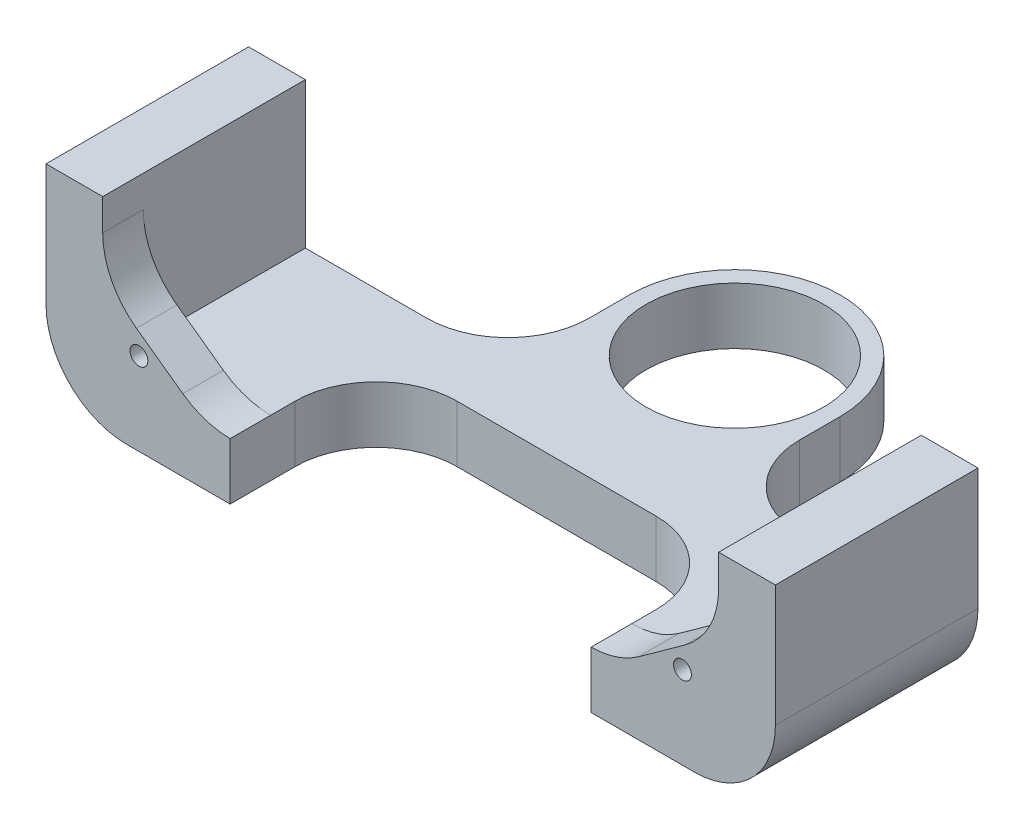
ISO-10303-21;
HEADER;
FILE_DESCRIPTION(('STEP AP214'),'2;1');
FILE_NAME('part.step','',(''),(''),'','','');
FILE_SCHEMA(('AUTOMOTIVE_DESIGN { 1 0 10303 214 1 1 1 1 }'));
ENDSEC;
DATA;
#1=APPLICATION_CONTEXT('core data for automotive mechanical design processes');
#2=APPLICATION_PROTOCOL_DEFINITION('international standard','automotive_design',2000,#1);
#3=PRODUCT_CONTEXT('',#1,'mechanical');
#4=PRODUCT('Part','Part','',(#3));
#5=PRODUCT_RELATED_PRODUCT_CATEGORY('part','',(#4));
#6=PRODUCT_DEFINITION_FORMATION('','',#4);
#7=PRODUCT_DEFINITION_CONTEXT('part definition',#1,'design');
#8=PRODUCT_DEFINITION('design','',#6,#7);
#9=PRODUCT_DEFINITION_SHAPE('','',#8);
#10=(LENGTH_UNIT() NAMED_UNIT(*) SI_UNIT(.MILLI.,.METRE.));
#11=(NAMED_UNIT(*) PLANE_ANGLE_UNIT() SI_UNIT($,.RADIAN.));
#12=(NAMED_UNIT(*) SI_UNIT($,.STERADIAN.) SOLID_ANGLE_UNIT());
#13=UNCERTAINTY_MEASURE_WITH_UNIT(LENGTH_MEASURE(1.E-05),#10,'distance_accuracy_value','');
#14=(GEOMETRIC_REPRESENTATION_CONTEXT(3) GLOBAL_UNCERTAINTY_ASSIGNED_CONTEXT((#13)) GLOBAL_UNIT_ASSIGNED_CONTEXT((#10,
#11,#12)) REPRESENTATION_CONTEXT('',''));
#15=CARTESIAN_POINT('',(0.,0.,0.));
#16=DIRECTION('',(0.,0.,1.));
#17=DIRECTION('',(1.,0.,0.));
#18=AXIS2_PLACEMENT_3D('',#15,#16,#17);
#19=CARTESIAN_POINT('',(0.,7.,40.));
#20=DIRECTION('',(0.,0.,-1.));
#21=DIRECTION('',(-1.,0.,0.));
#22=AXIS2_PLACEMENT_3D('',#19,#20,#21);
#23=PLANE('',#22);
#24=CARTESIAN_POINT('',(-20.5353755511933,10.2145296031408,40.));
#25=DIRECTION('',(0.,0.,-1.));
#26=DIRECTION('',(-1.,0.,0.));
#27=AXIS2_PLACEMENT_3D('',#24,#25,#26);
#28=CIRCLE('',#27,1.1);
#29=CARTESIAN_POINT('',(-21.6353755511933,10.2145296031408,40.));
#30=VERTEX_POINT('',#29);
#31=EDGE_CURVE('E325',#30,#30,#28,.T.);
#32=ORIENTED_EDGE('',*,*,#31,.T.);
#33=EDGE_LOOP('',(#32));
#34=FACE_BOUND('',#33,.T.);
#35=DIRECTION('',(1.,0.,0.));
#36=VECTOR('',#35,1.);
#37=CARTESIAN_POINT('',(0.,0.,40.));
#38=LINE('',#37,#36);
#39=CARTESIAN_POINT('',(-22.,0.,40.));
#40=VERTEX_POINT('',#39);
#41=CARTESIAN_POINT('',(-9.2745313325007,0.,40.));
#42=VERTEX_POINT('',#41);
#43=EDGE_CURVE('E248',#40,#42,#38,.T.);
#44=ORIENTED_EDGE('',*,*,#43,.T.);
#45=DIRECTION('',(0.,1.,0.));
#46=VECTOR('',#45,1.);
#47=CARTESIAN_POINT('',(-9.2745313325007,-48.0480903296918,40.));
#48=LINE('',#47,#46);
#49=CARTESIAN_POINT('',(-9.2745313325007,7.,40.));
#50=VERTEX_POINT('',#49);
#51=EDGE_CURVE('E232',#42,#50,#48,.T.);
#52=ORIENTED_EDGE('',*,*,#51,.T.);
#53=CARTESIAN_POINT('',(-9.2745313325007,17.,40.));
#54=DIRECTION('',(0.,0.,-1.));
#55=DIRECTION('',(-1.,0.,0.));
#56=AXIS2_PLACEMENT_3D('',#53,#54,#55);
#57=CIRCLE('',#56,10.);
#58=CARTESIAN_POINT('',(-15.1175785909515,8.88465658548506,40.));
#59=VERTEX_POINT('',#58);
#60=EDGE_CURVE('E245',#50,#59,#57,.T.);
#61=ORIENTED_EDGE('',*,*,#60,.T.);
#62=DIRECTION('',(0.811534341451495,-0.584304725845076,0.));
#63=VECTOR('',#62,1.);
#64=CARTESIAN_POINT('',(16.1749209694415,-13.6459430979979,40.));
#65=LINE('',#64,#63);
#66=CARTESIAN_POINT('',(-20.8430472584507,13.0069940260845,40.));
#67=VERTEX_POINT('',#66);
#68=EDGE_CURVE('E330',#67,#59,#65,.T.);
#69=ORIENTED_EDGE('',*,*,#68,.F.);
#70=CARTESIAN_POINT('',(-15.,21.1223374405995,40.));
#71=DIRECTION('',(0.,0.,-1.));
#72=DIRECTION('',(-1.,0.,0.));
#73=AXIS2_PLACEMENT_3D('',#70,#71,#72);
#74=CIRCLE('',#73,10.);
#75=CARTESIAN_POINT('',(-25.,21.1223374405995,40.));
#76=VERTEX_POINT('',#75);
#77=EDGE_CURVE('E471',#67,#76,#74,.T.);
#78=ORIENTED_EDGE('',*,*,#77,.T.);
#79=DIRECTION('',(0.,1.,0.));
#80=VECTOR('',#79,1.);
#81=CARTESIAN_POINT('',(-25.,0.,40.));
#82=LINE('',#81,#80);
#83=CARTESIAN_POINT('',(-25.,25.,40.));
#84=VERTEX_POINT('',#83);
#85=EDGE_CURVE('E336',#76,#84,#82,.T.);
#86=ORIENTED_EDGE('',*,*,#85,.T.);
#87=DIRECTION('',(1.,0.,0.));
#88=VECTOR('',#87,1.);
#89=CARTESIAN_POINT('',(26.,25.,40.));
#90=LINE('',#89,#88);
#91=CARTESIAN_POINT('',(-32.,25.,40.));
#92=VERTEX_POINT('',#91);
#93=EDGE_CURVE('E338',#92,#84,#90,.T.);
#94=ORIENTED_EDGE('',*,*,#93,.F.);
#95=DIRECTION('',(0.,1.,0.));
#96=VECTOR('',#95,1.);
#97=CARTESIAN_POINT('',(-32.,0.,40.));
#98=LINE('',#97,#96);
#99=CARTESIAN_POINT('',(-32.,10.,40.));
#100=VERTEX_POINT('',#99);
#101=EDGE_CURVE('E341',#100,#92,#98,.T.);
#102=ORIENTED_EDGE('',*,*,#101,.F.);
#103=CARTESIAN_POINT('',(-22.,10.,40.));
#104=DIRECTION('',(0.,0.,-1.));
#105=DIRECTION('',(-1.,0.,0.));
#106=AXIS2_PLACEMENT_3D('',#103,#104,#105);
#107=CIRCLE('',#106,10.);
#108=EDGE_CURVE('E448',#100,#40,#107,.F.);
#109=ORIENTED_EDGE('',*,*,#108,.T.);
#110=EDGE_LOOP('',(#44,#52,#61,#69,#78,#86,#94,#102,#109));
#111=FACE_BOUND('',#110,.T.);
#112=ADVANCED_FACE('F39',(#34,#111),#23,.F.);
#113=CARTESIAN_POINT('',(0.,7.,0.));
#114=DIRECTION('',(1.,0.,0.));
#115=DIRECTION('',(0.,0.,-1.));
#116=AXIS2_PLACEMENT_3D('',#113,#114,#115);
#117=PLANE('',#116);
#118=DIRECTION('',(0.,0.,1.));
#119=VECTOR('',#118,1.);
#120=CARTESIAN_POINT('',(0.,0.,0.));
#121=LINE('',#120,#119);
#122=CARTESIAN_POINT('',(0.,0.,0.));
#123=VERTEX_POINT('',#122);
#124=CARTESIAN_POINT('',(0.,0.,5.00000000000002));
#125=VERTEX_POINT('',#124);
#126=EDGE_CURVE('E412',#123,#125,#121,.T.);
#127=ORIENTED_EDGE('',*,*,#126,.T.);
#128=DIRECTION('',(0.,1.,0.));
#129=VECTOR('',#128,1.);
#130=CARTESIAN_POINT('',(0.,7.,5.00000000000002));
#131=LINE('',#130,#129);
#132=CARTESIAN_POINT('',(0.,7.,5.00000000000002));
#133=VERTEX_POINT('',#132);
#134=EDGE_CURVE('E468',#125,#133,#131,.T.);
#135=ORIENTED_EDGE('',*,*,#134,.T.);
#136=DIRECTION('',(0.,0.,1.));
#137=VECTOR('',#136,1.);
#138=CARTESIAN_POINT('',(0.,7.,0.));
#139=LINE('',#138,#137);
#140=CARTESIAN_POINT('',(0.,7.,0.));
#141=VERTEX_POINT('',#140);
#142=EDGE_CURVE('E403',#141,#133,#139,.T.);
#143=ORIENTED_EDGE('',*,*,#142,.F.);
#144=DIRECTION('',(0.,-1.,0.));
#145=VECTOR('',#144,1.);
#146=CARTESIAN_POINT('',(0.,7.,0.));
#147=LINE('',#146,#145);
#148=EDGE_CURVE('E420',#141,#123,#147,.T.);
#149=ORIENTED_EDGE('',*,*,#148,.T.);
#150=EDGE_LOOP('',(#127,#135,#143,#149));
#151=FACE_BOUND('',#150,.T.);
#152=ADVANCED_FACE('F529',(#151),#117,.F.);
#153=CARTESIAN_POINT('',(0.,0.,35.));
#154=DIRECTION('',(0.,0.,1.));
#155=DIRECTION('',(1.,0.,0.));
#156=AXIS2_PLACEMENT_3D('',#153,#154,#155);
#157=PLANE('',#156);
#158=CARTESIAN_POINT('',(46.5353755511933,10.2145296031408,35.));
#159=DIRECTION('',(0.,0.,1.));
#160=DIRECTION('',(1.,0.,0.));
#161=AXIS2_PLACEMENT_3D('',#158,#159,#160);
#162=CIRCLE('',#161,1.1);
#163=CARTESIAN_POINT('',(47.6353755511933,10.2145296031408,35.));
#164=VERTEX_POINT('',#163);
#165=EDGE_CURVE('E369',#164,#164,#162,.T.);
#166=ORIENTED_EDGE('',*,*,#165,.T.);
#167=EDGE_LOOP('',(#166));
#168=FACE_BOUND('',#167,.T.);
#169=DIRECTION('',(1.,0.,0.));
#170=VECTOR('',#169,1.);
#171=CARTESIAN_POINT('',(0.,7.,35.));
#172=LINE('',#171,#170);
#173=CARTESIAN_POINT('',(35.2745313325007,7.,35.));
#174=VERTEX_POINT('',#173);
#175=CARTESIAN_POINT('',(51.,7.,35.));
#176=VERTEX_POINT('',#175);
#177=EDGE_CURVE('E423',#174,#176,#172,.T.);
#178=ORIENTED_EDGE('',*,*,#177,.F.);
#179=CARTESIAN_POINT('',(35.2745313325007,17.,35.));
#180=DIRECTION('',(0.,0.,1.));
#181=DIRECTION('',(1.,0.,0.));
#182=AXIS2_PLACEMENT_3D('',#179,#180,#181);
#183=CIRCLE('',#182,10.);
#184=CARTESIAN_POINT('',(41.1175785909515,8.88465658548506,35.));
#185=VERTEX_POINT('',#184);
#186=EDGE_CURVE('E256',#174,#185,#183,.T.);
#187=ORIENTED_EDGE('',*,*,#186,.T.);
#188=DIRECTION('',(-0.811534341451495,-0.584304725845076,0.));
#189=VECTOR('',#188,1.);
#190=CARTESIAN_POINT('',(9.82507903055848,-13.6459430979979,35.));
#191=LINE('',#190,#189);
#192=CARTESIAN_POINT('',(46.8430472584508,13.0069940260845,35.));
#193=VERTEX_POINT('',#192);
#194=EDGE_CURVE('E372',#193,#185,#191,.T.);
#195=ORIENTED_EDGE('',*,*,#194,.F.);
#196=CARTESIAN_POINT('',(41.,21.1223374405995,35.));
#197=DIRECTION('',(0.,0.,1.));
#198=DIRECTION('',(1.,0.,0.));
#199=AXIS2_PLACEMENT_3D('',#196,#197,#198);
#200=CIRCLE('',#199,10.);
#201=CARTESIAN_POINT('',(51.,21.1223374405995,35.));
#202=VERTEX_POINT('',#201);
#203=EDGE_CURVE('E477',#193,#202,#200,.T.);
#204=ORIENTED_EDGE('',*,*,#203,.T.);
#205=DIRECTION('',(0.,1.,0.));
#206=VECTOR('',#205,1.);
#207=CARTESIAN_POINT('',(51.,16.,35.));
#208=LINE('',#207,#206);
#209=EDGE_CURVE('E347',#176,#202,#208,.T.);
#210=ORIENTED_EDGE('',*,*,#209,.F.);
#211=EDGE_LOOP('',(#178,#187,#195,#204,#210));
#212=FACE_BOUND('',#211,.T.);
#213=ADVANCED_FACE('F498',(#168,#212),#157,.F.);
#214=CARTESIAN_POINT('',(26.,7.,0.));
#215=DIRECTION('',(-1.,0.,0.));
#216=DIRECTION('',(0.,0.,1.));
#217=AXIS2_PLACEMENT_3D('',#214,#215,#216);
#218=PLANE('',#217);
#219=DIRECTION('',(0.,0.,-1.));
#220=VECTOR('',#219,1.);
#221=CARTESIAN_POINT('',(26.,7.,0.));
#222=LINE('',#221,#220);
#223=CARTESIAN_POINT('',(26.,7.,5.00000000000001));
#224=VERTEX_POINT('',#223);
#225=CARTESIAN_POINT('',(26.,7.,0.));
#226=VERTEX_POINT('',#225);
#227=EDGE_CURVE('E407',#224,#226,#222,.T.);
#228=ORIENTED_EDGE('',*,*,#227,.F.);
#229=DIRECTION('',(0.,1.,0.));
#230=VECTOR('',#229,1.);
#231=CARTESIAN_POINT('',(26.,7.,5.00000000000001));
#232=LINE('',#231,#230);
#233=CARTESIAN_POINT('',(26.,0.,5.00000000000001));
#234=VERTEX_POINT('',#233);
#235=EDGE_CURVE('E466',#224,#234,#232,.F.);
#236=ORIENTED_EDGE('',*,*,#235,.T.);
#237=DIRECTION('',(0.,0.,-1.));
#238=VECTOR('',#237,1.);
#239=CARTESIAN_POINT('',(26.,0.,0.));
#240=LINE('',#239,#238);
#241=CARTESIAN_POINT('',(26.,0.,0.));
#242=VERTEX_POINT('',#241);
#243=EDGE_CURVE('E404',#234,#242,#240,.T.);
#244=ORIENTED_EDGE('',*,*,#243,.T.);
#245=DIRECTION('',(0.,-1.,0.));
#246=VECTOR('',#245,1.);
#247=CARTESIAN_POINT('',(26.,7.,0.));
#248=LINE('',#247,#246);
#249=EDGE_CURVE('E409',#226,#242,#248,.T.);
#250=ORIENTED_EDGE('',*,*,#249,.F.);
#251=EDGE_LOOP('',(#228,#236,#244,#250));
#252=FACE_BOUND('',#251,.T.);
#253=ADVANCED_FACE('F518',(#252),#218,.F.);
#254=CARTESIAN_POINT('',(13.,7.,0.));
#255=DIRECTION('',(0.,1.,0.));
#256=DIRECTION('',(0.,0.,1.));
#257=AXIS2_PLACEMENT_3D('',#254,#255,#256);
#258=PLANE('',#257);
#259=DIRECTION('',(0.,0.,1.));
#260=VECTOR('',#259,1.);
#261=CARTESIAN_POINT('',(-9.2745313325007,7.,22.));
#262=LINE('',#261,#260);
#263=CARTESIAN_POINT('',(-9.2745313325007,7.,32.));
#264=VERTEX_POINT('',#263);
#265=CARTESIAN_POINT('',(-9.2745313325007,7.,35.));
#266=VERTEX_POINT('',#265);
#267=EDGE_CURVE('E234',#264,#266,#262,.T.);
#268=ORIENTED_EDGE('',*,*,#267,.F.);
#269=CARTESIAN_POINT('',(0.725468667499298,7.,32.));
#270=DIRECTION('',(0.,1.,0.));
#271=DIRECTION('',(0.,0.,1.));
#272=AXIS2_PLACEMENT_3D('',#269,#270,#271);
#273=CIRCLE('',#272,10.);
#274=CARTESIAN_POINT('',(0.725468667499299,7.,22.));
#275=VERTEX_POINT('',#274);
#276=EDGE_CURVE('E47',#264,#275,#273,.F.);
#277=ORIENTED_EDGE('',*,*,#276,.T.);
#278=DIRECTION('',(-1.,0.,0.));
#279=VECTOR('',#278,1.);
#280=CARTESIAN_POINT('',(-9.2745313325007,7.,22.));
#281=LINE('',#280,#279);
#282=CARTESIAN_POINT('',(25.2745313325007,7.,22.));
#283=VERTEX_POINT('',#282);
#284=EDGE_CURVE('E250',#283,#275,#281,.T.);
#285=ORIENTED_EDGE('',*,*,#284,.F.);
#286=CARTESIAN_POINT('',(25.2745313325007,7.,32.));
#287=DIRECTION('',(0.,1.,0.));
#288=DIRECTION('',(0.,0.,1.));
#289=AXIS2_PLACEMENT_3D('',#286,#287,#288);
#290=CIRCLE('',#289,10.);
#291=CARTESIAN_POINT('',(35.2745313325007,7.,32.));
#292=VERTEX_POINT('',#291);
#293=EDGE_CURVE('E281',#283,#292,#290,.F.);
#294=ORIENTED_EDGE('',*,*,#293,.T.);
#295=DIRECTION('',(0.,0.,-1.));
#296=VECTOR('',#295,1.);
#297=CARTESIAN_POINT('',(35.2745313325007,7.,22.));
#298=LINE('',#297,#296);
#299=EDGE_CURVE('E293',#174,#292,#298,.T.);
#300=ORIENTED_EDGE('',*,*,#299,.F.);
#301=ORIENTED_EDGE('',*,*,#177,.T.);
#302=DIRECTION('',(0.,0.,1.));
#303=VECTOR('',#302,1.);
#304=CARTESIAN_POINT('',(51.,7.,15.));
#305=LINE('',#304,#303);
#306=CARTESIAN_POINT('',(51.,7.,15.));
#307=VERTEX_POINT('',#306);
#308=EDGE_CURVE('E364',#307,#176,#305,.T.);
#309=ORIENTED_EDGE('',*,*,#308,.F.);
#310=DIRECTION('',(1.,0.,0.));
#311=VECTOR('',#310,1.);
#312=CARTESIAN_POINT('',(26.,7.,15.));
#313=LINE('',#312,#311);
#314=CARTESIAN_POINT('',(36.,7.,15.));
#315=VERTEX_POINT('',#314);
#316=EDGE_CURVE('E362',#315,#307,#313,.T.);
#317=ORIENTED_EDGE('',*,*,#316,.F.);
#318=CARTESIAN_POINT('',(36.,7.,5.));
#319=DIRECTION('',(0.,1.,0.));
#320=DIRECTION('',(0.,0.,1.));
#321=AXIS2_PLACEMENT_3D('',#318,#319,#320);
#322=CIRCLE('',#321,10.);
#323=EDGE_CURVE('E259',#315,#224,#322,.F.);
#324=ORIENTED_EDGE('',*,*,#323,.T.);
#325=ORIENTED_EDGE('',*,*,#227,.T.);
#326=CARTESIAN_POINT('',(13.,7.,0.));
#327=DIRECTION('',(0.,1.,0.));
#328=DIRECTION('',(0.,0.,1.));
#329=AXIS2_PLACEMENT_3D('',#326,#327,#328);
#330=CIRCLE('',#329,13.);
#331=EDGE_CURVE('E400',#226,#141,#330,.T.);
#332=ORIENTED_EDGE('',*,*,#331,.T.);
#333=ORIENTED_EDGE('',*,*,#142,.T.);
#334=CARTESIAN_POINT('',(-10.,7.,5.00000000000002));
#335=DIRECTION('',(0.,1.,0.));
#336=DIRECTION('',(0.,0.,1.));
#337=AXIS2_PLACEMENT_3D('',#334,#335,#336);
#338=CIRCLE('',#337,10.);
#339=CARTESIAN_POINT('',(-9.99999999999999,7.,15.));
#340=VERTEX_POINT('',#339);
#341=EDGE_CURVE('E268',#133,#340,#338,.F.);
#342=ORIENTED_EDGE('',*,*,#341,.T.);
#343=DIRECTION('',(-1.,0.,0.));
#344=VECTOR('',#343,1.);
#345=CARTESIAN_POINT('',(-25.,7.,15.));
#346=LINE('',#345,#344);
#347=CARTESIAN_POINT('',(-25.,7.,15.));
#348=VERTEX_POINT('',#347);
#349=EDGE_CURVE('E311',#340,#348,#346,.T.);
#350=ORIENTED_EDGE('',*,*,#349,.T.);
#351=DIRECTION('',(0.,0.,1.));
#352=VECTOR('',#351,1.);
#353=CARTESIAN_POINT('',(-25.,7.,15.));
#354=LINE('',#353,#352);
#355=CARTESIAN_POINT('',(-25.,6.99999999999999,35.));
#356=VERTEX_POINT('',#355);
#357=EDGE_CURVE('E321',#348,#356,#354,.T.);
#358=ORIENTED_EDGE('',*,*,#357,.T.);
#359=DIRECTION('',(-1.,0.,0.));
#360=VECTOR('',#359,1.);
#361=CARTESIAN_POINT('',(26.,7.00000000000001,35.));
#362=LINE('',#361,#360);
#363=EDGE_CURVE('E426',#266,#356,#362,.T.);
#364=ORIENTED_EDGE('',*,*,#363,.F.);
#365=EDGE_LOOP('',(#268,#277,#285,#294,#300,#301,#309,#317,#324,#325,#332,#333,#342,#350,#358,#364));
#366=FACE_BOUND('',#365,.T.);
#367=CARTESIAN_POINT('',(13.,7.,0.));
#368=DIRECTION('',(0.,1.,0.));
#369=DIRECTION('',(0.,0.,1.));
#370=AXIS2_PLACEMENT_3D('',#367,#368,#369);
#371=CIRCLE('',#370,10.975);
#372=CARTESIAN_POINT('',(13.,7.,10.975));
#373=VERTEX_POINT('',#372);
#374=EDGE_CURVE('E394',#373,#373,#371,.T.);
#375=ORIENTED_EDGE('',*,*,#374,.F.);
#376=EDGE_LOOP('',(#375));
#377=FACE_BOUND('',#376,.T.);
#378=ADVANCED_FACE('F287',(#366,#377),#258,.T.);
#379=CARTESIAN_POINT('',(13.,0.,0.));
#380=DIRECTION('',(0.,1.,0.));
#381=DIRECTION('',(0.,0.,1.));
#382=AXIS2_PLACEMENT_3D('',#379,#380,#381);
#383=PLANE('',#382);
#384=DIRECTION('',(1.,0.,0.));
#385=VECTOR('',#384,1.);
#386=CARTESIAN_POINT('',(-9.2745313325007,0.,22.));
#387=LINE('',#386,#385);
#388=CARTESIAN_POINT('',(0.725468667499299,0.,22.));
#389=VERTEX_POINT('',#388);
#390=CARTESIAN_POINT('',(25.2745313325007,0.,22.));
#391=VERTEX_POINT('',#390);
#392=EDGE_CURVE('E297',#389,#391,#387,.T.);
#393=ORIENTED_EDGE('',*,*,#392,.F.);
#394=CARTESIAN_POINT('',(0.725468667499298,0.,32.));
#395=DIRECTION('',(0.,1.,0.));
#396=DIRECTION('',(0.,0.,1.));
#397=AXIS2_PLACEMENT_3D('',#394,#395,#396);
#398=CIRCLE('',#397,10.);
#399=CARTESIAN_POINT('',(-9.2745313325007,0.,32.));
#400=VERTEX_POINT('',#399);
#401=EDGE_CURVE('E11',#389,#400,#398,.T.);
#402=ORIENTED_EDGE('',*,*,#401,.T.);
#403=DIRECTION('',(0.,0.,-1.));
#404=VECTOR('',#403,1.);
#405=CARTESIAN_POINT('',(-9.2745313325007,0.,22.));
#406=LINE('',#405,#404);
#407=EDGE_CURVE('E295',#42,#400,#406,.T.);
#408=ORIENTED_EDGE('',*,*,#407,.F.);
#409=ORIENTED_EDGE('',*,*,#43,.F.);
#410=DIRECTION('',(0.,0.,1.));
#411=VECTOR('',#410,1.);
#412=CARTESIAN_POINT('',(-22.,0.,0.));
#413=LINE('',#412,#411);
#414=CARTESIAN_POINT('',(-22.,0.,15.));
#415=VERTEX_POINT('',#414);
#416=EDGE_CURVE('E453',#40,#415,#413,.F.);
#417=ORIENTED_EDGE('',*,*,#416,.T.);
#418=DIRECTION('',(1.,0.,0.));
#419=VECTOR('',#418,1.);
#420=CARTESIAN_POINT('',(-32.,0.,15.));
#421=LINE('',#420,#419);
#422=CARTESIAN_POINT('',(-9.99999999999999,0.,15.));
#423=VERTEX_POINT('',#422);
#424=EDGE_CURVE('E313',#415,#423,#421,.T.);
#425=ORIENTED_EDGE('',*,*,#424,.T.);
#426=CARTESIAN_POINT('',(-10.,0.,5.00000000000002));
#427=DIRECTION('',(0.,1.,0.));
#428=DIRECTION('',(0.,0.,1.));
#429=AXIS2_PLACEMENT_3D('',#426,#427,#428);
#430=CIRCLE('',#429,10.);
#431=EDGE_CURVE('E270',#423,#125,#430,.T.);
#432=ORIENTED_EDGE('',*,*,#431,.T.);
#433=ORIENTED_EDGE('',*,*,#126,.F.);
#434=CARTESIAN_POINT('',(13.,0.,0.));
#435=DIRECTION('',(0.,1.,0.));
#436=DIRECTION('',(0.,0.,1.));
#437=AXIS2_PLACEMENT_3D('',#434,#435,#436);
#438=CIRCLE('',#437,13.);
#439=EDGE_CURVE('E397',#242,#123,#438,.T.);
#440=ORIENTED_EDGE('',*,*,#439,.F.);
#441=ORIENTED_EDGE('',*,*,#243,.F.);
#442=CARTESIAN_POINT('',(36.,0.,5.));
#443=DIRECTION('',(0.,1.,0.));
#444=DIRECTION('',(0.,0.,1.));
#445=AXIS2_PLACEMENT_3D('',#442,#443,#444);
#446=CIRCLE('',#445,10.);
#447=CARTESIAN_POINT('',(36.,0.,15.));
#448=VERTEX_POINT('',#447);
#449=EDGE_CURVE('E266',#234,#448,#446,.T.);
#450=ORIENTED_EDGE('',*,*,#449,.T.);
#451=DIRECTION('',(-1.,0.,0.));
#452=VECTOR('',#451,1.);
#453=CARTESIAN_POINT('',(58.,0.,15.));
#454=LINE('',#453,#452);
#455=CARTESIAN_POINT('',(48.,0.,15.));
#456=VERTEX_POINT('',#455);
#457=EDGE_CURVE('E359',#456,#448,#454,.T.);
#458=ORIENTED_EDGE('',*,*,#457,.F.);
#459=DIRECTION('',(0.,0.,1.));
#460=VECTOR('',#459,1.);
#461=CARTESIAN_POINT('',(48.,0.,40.));
#462=LINE('',#461,#460);
#463=CARTESIAN_POINT('',(48.,0.,40.));
#464=VERTEX_POINT('',#463);
#465=EDGE_CURVE('E450',#456,#464,#462,.T.);
#466=ORIENTED_EDGE('',*,*,#465,.T.);
#467=CARTESIAN_POINT('',(35.2745313325007,0.,40.));
#468=VERTEX_POINT('',#467);
#469=EDGE_CURVE('E415',#468,#464,#38,.T.);
#470=ORIENTED_EDGE('',*,*,#469,.F.);
#471=DIRECTION('',(0.,0.,1.));
#472=VECTOR('',#471,1.);
#473=CARTESIAN_POINT('',(35.2745313325007,0.,22.));
#474=LINE('',#473,#472);
#475=CARTESIAN_POINT('',(35.2745313325007,0.,32.));
#476=VERTEX_POINT('',#475);
#477=EDGE_CURVE('E301',#476,#468,#474,.T.);
#478=ORIENTED_EDGE('',*,*,#477,.F.);
#479=CARTESIAN_POINT('',(25.2745313325007,0.,32.));
#480=DIRECTION('',(0.,1.,0.));
#481=DIRECTION('',(0.,0.,1.));
#482=AXIS2_PLACEMENT_3D('',#479,#480,#481);
#483=CIRCLE('',#482,10.);
#484=EDGE_CURVE('E283',#476,#391,#483,.T.);
#485=ORIENTED_EDGE('',*,*,#484,.T.);
#486=EDGE_LOOP('',(#393,#402,#408,#409,#417,#425,#432,#433,#440,#441,#450,#458,#466,#470,#478,#485));
#487=FACE_BOUND('',#486,.T.);
#488=CARTESIAN_POINT('',(13.,0.,0.));
#489=DIRECTION('',(0.,1.,0.));
#490=DIRECTION('',(0.,0.,1.));
#491=AXIS2_PLACEMENT_3D('',#488,#489,#490);
#492=CIRCLE('',#491,10.975);
#493=CARTESIAN_POINT('',(13.,0.,10.975));
#494=VERTEX_POINT('',#493);
#495=EDGE_CURVE('E391',#494,#494,#492,.T.);
#496=ORIENTED_EDGE('',*,*,#495,.T.);
#497=EDGE_LOOP('',(#496));
#498=FACE_BOUND('',#497,.T.);
#499=ADVANCED_FACE('F521',(#487,#498),#383,.F.);
#500=CARTESIAN_POINT('',(13.,7.,0.));
#501=DIRECTION('',(0.,-1.,0.));
#502=DIRECTION('',(0.,0.,-1.));
#503=AXIS2_PLACEMENT_3D('',#500,#501,#502);
#504=CYLINDRICAL_SURFACE('',#503,13.);
#505=ORIENTED_EDGE('',*,*,#439,.T.);
#506=ORIENTED_EDGE('',*,*,#148,.F.);
#507=ORIENTED_EDGE('',*,*,#331,.F.);
#508=ORIENTED_EDGE('',*,*,#249,.T.);
#509=EDGE_LOOP('',(#505,#506,#507,#508));
#510=FACE_BOUND('',#509,.T.);
#511=ADVANCED_FACE('F525',(#510),#504,.T.);
#512=CARTESIAN_POINT('',(35.2745313325007,17.,40.));
#513=DIRECTION('',(0.,0.,-1.));
#514=DIRECTION('',(-1.,0.,0.));
#515=AXIS2_PLACEMENT_3D('',#512,#513,#514);
#516=CIRCLE('',#515,10.);
#517=CARTESIAN_POINT('',(41.1175785909515,8.88465658548506,40.));
#518=VERTEX_POINT('',#517);
#519=CARTESIAN_POINT('',(35.2745313325007,7.,40.));
#520=VERTEX_POINT('',#519);
#521=EDGE_CURVE('E261',#518,#520,#516,.T.);
#522=ORIENTED_EDGE('',*,*,#521,.T.);
#523=DIRECTION('',(0.,1.,0.));
#524=VECTOR('',#523,1.);
#525=CARTESIAN_POINT('',(35.2745313325007,-48.0480903296918,40.));
#526=LINE('',#525,#524);
#527=EDGE_CURVE('E249',#468,#520,#526,.T.);
#528=ORIENTED_EDGE('',*,*,#527,.F.);
#529=ORIENTED_EDGE('',*,*,#469,.T.);
#530=CARTESIAN_POINT('',(48.,10.,40.));
#531=DIRECTION('',(0.,0.,-1.));
#532=DIRECTION('',(-1.,0.,0.));
#533=AXIS2_PLACEMENT_3D('',#530,#531,#532);
#534=CIRCLE('',#533,10.);
#535=CARTESIAN_POINT('',(58.,10.,40.));
#536=VERTEX_POINT('',#535);
#537=EDGE_CURVE('E446',#464,#536,#534,.F.);
#538=ORIENTED_EDGE('',*,*,#537,.T.);
#539=DIRECTION('',(0.,1.,0.));
#540=VECTOR('',#539,1.);
#541=CARTESIAN_POINT('',(58.,0.,40.));
#542=LINE('',#541,#540);
#543=CARTESIAN_POINT('',(58.,25.,40.));
#544=VERTEX_POINT('',#543);
#545=EDGE_CURVE('E384',#536,#544,#542,.T.);
#546=ORIENTED_EDGE('',*,*,#545,.T.);
#547=DIRECTION('',(-1.,0.,0.));
#548=VECTOR('',#547,1.);
#549=CARTESIAN_POINT('',(0.,25.,40.));
#550=LINE('',#549,#548);
#551=CARTESIAN_POINT('',(51.,25.,40.));
#552=VERTEX_POINT('',#551);
#553=EDGE_CURVE('E373',#544,#552,#550,.T.);
#554=ORIENTED_EDGE('',*,*,#553,.T.);
#555=DIRECTION('',(0.,1.,0.));
#556=VECTOR('',#555,1.);
#557=CARTESIAN_POINT('',(51.,0.,40.));
#558=LINE('',#557,#556);
#559=CARTESIAN_POINT('',(51.,21.1223374405995,40.));
#560=VERTEX_POINT('',#559);
#561=EDGE_CURVE('E379',#560,#552,#558,.T.);
#562=ORIENTED_EDGE('',*,*,#561,.F.);
#563=CARTESIAN_POINT('',(41.,21.1223374405995,40.));
#564=DIRECTION('',(0.,0.,-1.));
#565=DIRECTION('',(-1.,0.,0.));
#566=AXIS2_PLACEMENT_3D('',#563,#564,#565);
#567=CIRCLE('',#566,10.);
#568=CARTESIAN_POINT('',(46.8430472584508,13.0069940260845,40.));
#569=VERTEX_POINT('',#568);
#570=EDGE_CURVE('E475',#560,#569,#567,.T.);
#571=ORIENTED_EDGE('',*,*,#570,.T.);
#572=DIRECTION('',(-0.811534341451495,-0.584304725845076,0.));
#573=VECTOR('',#572,1.);
#574=CARTESIAN_POINT('',(9.82507903055848,-13.6459430979979,40.));
#575=LINE('',#574,#573);
#576=EDGE_CURVE('E381',#569,#518,#575,.T.);
#577=ORIENTED_EDGE('',*,*,#576,.T.);
#578=EDGE_LOOP('',(#522,#528,#529,#538,#546,#554,#562,#571,#577));
#579=FACE_BOUND('',#578,.T.);
#580=CARTESIAN_POINT('',(46.5353755511933,10.2145296031408,40.));
#581=DIRECTION('',(0.,0.,1.));
#582=DIRECTION('',(1.,0.,0.));
#583=AXIS2_PLACEMENT_3D('',#580,#581,#582);
#584=CIRCLE('',#583,1.1);
#585=CARTESIAN_POINT('',(47.6353755511933,10.2145296031408,40.));
#586=VERTEX_POINT('',#585);
#587=EDGE_CURVE('E368',#586,#586,#584,.T.);
#588=ORIENTED_EDGE('',*,*,#587,.F.);
#589=EDGE_LOOP('',(#588));
#590=FACE_BOUND('',#589,.T.);
#591=ADVANCED_FACE('F483',(#579,#590),#23,.F.);
#592=CARTESIAN_POINT('',(13.,7.,0.));
#593=DIRECTION('',(0.,-1.,0.));
#594=DIRECTION('',(0.,0.,-1.));
#595=AXIS2_PLACEMENT_3D('',#592,#593,#594);
#596=CYLINDRICAL_SURFACE('',#595,10.975);
#597=ORIENTED_EDGE('',*,*,#374,.T.);
#598=EDGE_LOOP('',(#597));
#599=FACE_BOUND('',#598,.T.);
#600=ORIENTED_EDGE('',*,*,#495,.F.);
#601=EDGE_LOOP('',(#600));
#602=FACE_BOUND('',#601,.T.);
#603=ADVANCED_FACE('F587',(#599,#602),#596,.F.);
#604=CARTESIAN_POINT('',(51.,0.,35.));
#605=DIRECTION('',(1.,0.,0.));
#606=DIRECTION('',(0.,1.,0.));
#607=AXIS2_PLACEMENT_3D('',#604,#605,#606);
#608=PLANE('',#607);
#609=ORIENTED_EDGE('',*,*,#209,.T.);
#610=DIRECTION('',(0.,0.,1.));
#611=VECTOR('',#610,1.);
#612=CARTESIAN_POINT('',(51.,21.1223374405995,35.));
#613=LINE('',#612,#611);
#614=EDGE_CURVE('E435',#202,#560,#613,.T.);
#615=ORIENTED_EDGE('',*,*,#614,.T.);
#616=ORIENTED_EDGE('',*,*,#561,.T.);
#617=DIRECTION('',(0.,0.,1.));
#618=VECTOR('',#617,1.);
#619=CARTESIAN_POINT('',(51.,25.,35.));
#620=LINE('',#619,#618);
#621=CARTESIAN_POINT('',(51.,25.,15.));
#622=VERTEX_POINT('',#621);
#623=EDGE_CURVE('E388',#622,#552,#620,.T.);
#624=ORIENTED_EDGE('',*,*,#623,.F.);
#625=DIRECTION('',(0.,1.,0.));
#626=VECTOR('',#625,1.);
#627=CARTESIAN_POINT('',(51.,16.,15.));
#628=LINE('',#627,#626);
#629=EDGE_CURVE('E350',#307,#622,#628,.T.);
#630=ORIENTED_EDGE('',*,*,#629,.F.);
#631=ORIENTED_EDGE('',*,*,#308,.T.);
#632=EDGE_LOOP('',(#609,#615,#616,#624,#630,#631));
#633=FACE_BOUND('',#632,.T.);
#634=ADVANCED_FACE('F503',(#633),#608,.F.);
#635=CARTESIAN_POINT('',(0.,25.,35.));
#636=DIRECTION('',(0.,1.,0.));
#637=DIRECTION('',(0.,0.,1.));
#638=AXIS2_PLACEMENT_3D('',#635,#636,#637);
#639=PLANE('',#638);
#640=ORIENTED_EDGE('',*,*,#553,.F.);
#641=DIRECTION('',(0.,0.,1.));
#642=VECTOR('',#641,1.);
#643=CARTESIAN_POINT('',(58.,25.,35.));
#644=LINE('',#643,#642);
#645=CARTESIAN_POINT('',(58.,25.,15.));
#646=VERTEX_POINT('',#645);
#647=EDGE_CURVE('E376',#646,#544,#644,.T.);
#648=ORIENTED_EDGE('',*,*,#647,.F.);
#649=DIRECTION('',(1.,0.,0.));
#650=VECTOR('',#649,1.);
#651=CARTESIAN_POINT('',(51.,25.,15.));
#652=LINE('',#651,#650);
#653=EDGE_CURVE('E353',#622,#646,#652,.T.);
#654=ORIENTED_EDGE('',*,*,#653,.F.);
#655=ORIENTED_EDGE('',*,*,#623,.T.);
#656=EDGE_LOOP('',(#640,#648,#654,#655));
#657=FACE_BOUND('',#656,.T.);
#658=ADVANCED_FACE('F613',(#657),#639,.T.);
#659=CARTESIAN_POINT('',(58.,0.,35.));
#660=DIRECTION('',(1.,0.,0.));
#661=DIRECTION('',(0.,0.,-1.));
#662=AXIS2_PLACEMENT_3D('',#659,#660,#661);
#663=PLANE('',#662);
#664=ORIENTED_EDGE('',*,*,#545,.F.);
#665=DIRECTION('',(0.,0.,1.));
#666=VECTOR('',#665,1.);
#667=CARTESIAN_POINT('',(58.,10.,15.));
#668=LINE('',#667,#666);
#669=CARTESIAN_POINT('',(58.,10.,15.));
#670=VERTEX_POINT('',#669);
#671=EDGE_CURVE('E459',#536,#670,#668,.F.);
#672=ORIENTED_EDGE('',*,*,#671,.T.);
#673=DIRECTION('',(0.,-1.,0.));
#674=VECTOR('',#673,1.);
#675=CARTESIAN_POINT('',(58.,25.,15.));
#676=LINE('',#675,#674);
#677=EDGE_CURVE('E356',#646,#670,#676,.T.);
#678=ORIENTED_EDGE('',*,*,#677,.F.);
#679=ORIENTED_EDGE('',*,*,#647,.T.);
#680=EDGE_LOOP('',(#664,#672,#678,#679));
#681=FACE_BOUND('',#680,.T.);
#682=ADVANCED_FACE('F616',(#681),#663,.T.);
#683=CARTESIAN_POINT('',(46.5353755511933,10.2145296031408,35.));
#684=DIRECTION('',(0.,0.,1.));
#685=DIRECTION('',(1.,0.,0.));
#686=AXIS2_PLACEMENT_3D('',#683,#684,#685);
#687=CYLINDRICAL_SURFACE('',#686,1.1);
#688=ORIENTED_EDGE('',*,*,#165,.F.);
#689=EDGE_LOOP('',(#688));
#690=FACE_BOUND('',#689,.T.);
#691=ORIENTED_EDGE('',*,*,#587,.T.);
#692=EDGE_LOOP('',(#691));
#693=FACE_BOUND('',#692,.T.);
#694=ADVANCED_FACE('F620',(#690,#693),#687,.F.);
#695=CARTESIAN_POINT('',(9.82507903055848,-13.6459430979979,35.));
#696=DIRECTION('',(-0.584304725845076,0.811534341451495,0.));
#697=DIRECTION('',(-0.811534341451495,-0.584304725845076,0.));
#698=AXIS2_PLACEMENT_3D('',#695,#696,#697);
#699=PLANE('',#698);
#700=ORIENTED_EDGE('',*,*,#576,.F.);
#701=DIRECTION('',(0.,0.,1.));
#702=VECTOR('',#701,1.);
#703=CARTESIAN_POINT('',(46.8430472584508,13.0069940260845,35.));
#704=LINE('',#703,#702);
#705=EDGE_CURVE('E240',#569,#193,#704,.F.);
#706=ORIENTED_EDGE('',*,*,#705,.T.);
#707=ORIENTED_EDGE('',*,*,#194,.T.);
#708=DIRECTION('',(0.,0.,1.));
#709=VECTOR('',#708,1.);
#710=CARTESIAN_POINT('',(41.1175785909515,8.88465658548505,40.));
#711=LINE('',#710,#709);
#712=EDGE_CURVE('E438',#185,#518,#711,.T.);
#713=ORIENTED_EDGE('',*,*,#712,.T.);
#714=EDGE_LOOP('',(#700,#706,#707,#713));
#715=FACE_BOUND('',#714,.T.);
#716=ADVANCED_FACE('F622',(#715),#699,.T.);
#717=CARTESIAN_POINT('',(0.,0.,15.));
#718=DIRECTION('',(0.,0.,-1.));
#719=DIRECTION('',(-1.,0.,0.));
#720=AXIS2_PLACEMENT_3D('',#717,#718,#719);
#721=PLANE('',#720);
#722=ORIENTED_EDGE('',*,*,#677,.T.);
#723=CARTESIAN_POINT('',(48.,10.,15.));
#724=DIRECTION('',(0.,0.,-1.));
#725=DIRECTION('',(-1.,0.,0.));
#726=AXIS2_PLACEMENT_3D('',#723,#724,#725);
#727=CIRCLE('',#726,10.);
#728=EDGE_CURVE('E464',#670,#456,#727,.T.);
#729=ORIENTED_EDGE('',*,*,#728,.T.);
#730=ORIENTED_EDGE('',*,*,#457,.T.);
#731=DIRECTION('',(0.,1.,0.));
#732=VECTOR('',#731,1.);
#733=CARTESIAN_POINT('',(36.,0.,15.));
#734=LINE('',#733,#732);
#735=EDGE_CURVE('E461',#448,#315,#734,.T.);
#736=ORIENTED_EDGE('',*,*,#735,.T.);
#737=ORIENTED_EDGE('',*,*,#316,.T.);
#738=ORIENTED_EDGE('',*,*,#629,.T.);
#739=ORIENTED_EDGE('',*,*,#653,.T.);
#740=EDGE_LOOP('',(#722,#729,#730,#736,#737,#738,#739));
#741=FACE_BOUND('',#740,.T.);
#742=ADVANCED_FACE('F509',(#741),#721,.T.);
#743=CARTESIAN_POINT('',(-25.,0.,35.));
#744=DIRECTION('',(1.,0.,0.));
#745=DIRECTION('',(0.,1.,0.));
#746=AXIS2_PLACEMENT_3D('',#743,#744,#745);
#747=PLANE('',#746);
#748=ORIENTED_EDGE('',*,*,#85,.F.);
#749=DIRECTION('',(0.,0.,1.));
#750=VECTOR('',#749,1.);
#751=CARTESIAN_POINT('',(-25.,21.1223374405995,35.));
#752=LINE('',#751,#750);
#753=CARTESIAN_POINT('',(-25.,21.1223374405995,35.));
#754=VERTEX_POINT('',#753);
#755=EDGE_CURVE('E432',#76,#754,#752,.F.);
#756=ORIENTED_EDGE('',*,*,#755,.T.);
#757=DIRECTION('',(0.,1.,0.));
#758=VECTOR('',#757,1.);
#759=CARTESIAN_POINT('',(-25.,16.,35.));
#760=LINE('',#759,#758);
#761=EDGE_CURVE('E296',#356,#754,#760,.T.);
#762=ORIENTED_EDGE('',*,*,#761,.F.);
#763=ORIENTED_EDGE('',*,*,#357,.F.);
#764=DIRECTION('',(0.,1.,0.));
#765=VECTOR('',#764,1.);
#766=CARTESIAN_POINT('',(-25.,16.,15.));
#767=LINE('',#766,#765);
#768=CARTESIAN_POINT('',(-25.,25.,15.));
#769=VERTEX_POINT('',#768);
#770=EDGE_CURVE('E299',#348,#769,#767,.T.);
#771=ORIENTED_EDGE('',*,*,#770,.T.);
#772=DIRECTION('',(0.,0.,1.));
#773=VECTOR('',#772,1.);
#774=CARTESIAN_POINT('',(-25.,25.,35.));
#775=LINE('',#774,#773);
#776=EDGE_CURVE('E333',#769,#84,#775,.T.);
#777=ORIENTED_EDGE('',*,*,#776,.T.);
#778=EDGE_LOOP('',(#748,#756,#762,#763,#771,#777));
#779=FACE_BOUND('',#778,.T.);
#780=ADVANCED_FACE('F556',(#779),#747,.T.);
#781=CARTESIAN_POINT('',(16.1749209694415,-13.6459430979979,35.));
#782=DIRECTION('',(-0.584304725845076,-0.811534341451495,0.));
#783=DIRECTION('',(0.811534341451495,-0.584304725845076,0.));
#784=AXIS2_PLACEMENT_3D('',#781,#782,#783);
#785=PLANE('',#784);
#786=DIRECTION('',(0.811534341451495,-0.584304725845076,0.));
#787=VECTOR('',#786,1.);
#788=CARTESIAN_POINT('',(16.1749209694415,-13.6459430979979,35.));
#789=LINE('',#788,#787);
#790=CARTESIAN_POINT('',(-20.8430472584508,13.0069940260845,35.));
#791=VERTEX_POINT('',#790);
#792=CARTESIAN_POINT('',(-15.1175785909515,8.88465658548506,35.));
#793=VERTEX_POINT('',#792);
#794=EDGE_CURVE('E329',#791,#793,#789,.T.);
#795=ORIENTED_EDGE('',*,*,#794,.F.);
#796=DIRECTION('',(0.,0.,1.));
#797=VECTOR('',#796,1.);
#798=CARTESIAN_POINT('',(-20.8430472584508,13.0069940260845,35.));
#799=LINE('',#798,#797);
#800=EDGE_CURVE('E429',#791,#67,#799,.T.);
#801=ORIENTED_EDGE('',*,*,#800,.T.);
#802=ORIENTED_EDGE('',*,*,#68,.T.);
#803=DIRECTION('',(0.,0.,1.));
#804=VECTOR('',#803,1.);
#805=CARTESIAN_POINT('',(-15.1175785909515,8.88465658548506,35.));
#806=LINE('',#805,#804);
#807=EDGE_CURVE('E254',#59,#793,#806,.F.);
#808=ORIENTED_EDGE('',*,*,#807,.T.);
#809=EDGE_LOOP('',(#795,#801,#802,#808));
#810=FACE_BOUND('',#809,.T.);
#811=ADVANCED_FACE('F563',(#810),#785,.F.);
#812=CARTESIAN_POINT('',(-32.,0.,35.));
#813=DIRECTION('',(1.,0.,0.));
#814=DIRECTION('',(0.,0.,-1.));
#815=AXIS2_PLACEMENT_3D('',#812,#813,#814);
#816=PLANE('',#815);
#817=DIRECTION('',(0.,-1.,0.));
#818=VECTOR('',#817,1.);
#819=CARTESIAN_POINT('',(-32.,25.,15.));
#820=LINE('',#819,#818);
#821=CARTESIAN_POINT('',(-32.,25.,15.));
#822=VERTEX_POINT('',#821);
#823=CARTESIAN_POINT('',(-32.,10.,15.));
#824=VERTEX_POINT('',#823);
#825=EDGE_CURVE('E316',#822,#824,#820,.T.);
#826=ORIENTED_EDGE('',*,*,#825,.T.);
#827=DIRECTION('',(0.,0.,1.));
#828=VECTOR('',#827,1.);
#829=CARTESIAN_POINT('',(-32.,10.,35.));
#830=LINE('',#829,#828);
#831=EDGE_CURVE('E443',#824,#100,#830,.T.);
#832=ORIENTED_EDGE('',*,*,#831,.T.);
#833=ORIENTED_EDGE('',*,*,#101,.T.);
#834=DIRECTION('',(0.,0.,1.));
#835=VECTOR('',#834,1.);
#836=CARTESIAN_POINT('',(-32.,25.,35.));
#837=LINE('',#836,#835);
#838=EDGE_CURVE('E344',#822,#92,#837,.T.);
#839=ORIENTED_EDGE('',*,*,#838,.F.);
#840=EDGE_LOOP('',(#826,#832,#833,#839));
#841=FACE_BOUND('',#840,.T.);
#842=ADVANCED_FACE('F547',(#841),#816,.F.);
#843=CARTESIAN_POINT('',(-20.5353755511933,10.2145296031408,35.));
#844=DIRECTION('',(0.,0.,1.));
#845=DIRECTION('',(1.,0.,0.));
#846=AXIS2_PLACEMENT_3D('',#843,#844,#845);
#847=CYLINDRICAL_SURFACE('',#846,1.1);
#848=CARTESIAN_POINT('',(-20.5353755511933,10.2145296031408,35.));
#849=DIRECTION('',(0.,0.,-1.));
#850=DIRECTION('',(-1.,0.,0.));
#851=AXIS2_PLACEMENT_3D('',#848,#849,#850);
#852=CIRCLE('',#851,1.1);
#853=CARTESIAN_POINT('',(-21.6353755511933,10.2145296031408,35.));
#854=VERTEX_POINT('',#853);
#855=EDGE_CURVE('E326',#854,#854,#852,.T.);
#856=ORIENTED_EDGE('',*,*,#855,.T.);
#857=EDGE_LOOP('',(#856));
#858=FACE_BOUND('',#857,.T.);
#859=ORIENTED_EDGE('',*,*,#31,.F.);
#860=EDGE_LOOP('',(#859));
#861=FACE_BOUND('',#860,.T.);
#862=ADVANCED_FACE('F666',(#858,#861),#847,.F.);
#863=CARTESIAN_POINT('',(26.,25.,35.));
#864=DIRECTION('',(0.,-1.,0.));
#865=DIRECTION('',(0.,0.,-1.));
#866=AXIS2_PLACEMENT_3D('',#863,#864,#865);
#867=PLANE('',#866);
#868=ORIENTED_EDGE('',*,*,#93,.T.);
#869=ORIENTED_EDGE('',*,*,#776,.F.);
#870=DIRECTION('',(-1.,0.,0.));
#871=VECTOR('',#870,1.);
#872=CARTESIAN_POINT('',(-25.,25.,15.));
#873=LINE('',#872,#871);
#874=EDGE_CURVE('E319',#769,#822,#873,.T.);
#875=ORIENTED_EDGE('',*,*,#874,.T.);
#876=ORIENTED_EDGE('',*,*,#838,.T.);
#877=EDGE_LOOP('',(#868,#869,#875,#876));
#878=FACE_BOUND('',#877,.T.);
#879=ADVANCED_FACE('F551',(#878),#867,.F.);
#880=CARTESIAN_POINT('',(26.,0.,35.));
#881=DIRECTION('',(0.,0.,1.));
#882=DIRECTION('',(-1.,0.,0.));
#883=AXIS2_PLACEMENT_3D('',#880,#881,#882);
#884=PLANE('',#883);
#885=ORIENTED_EDGE('',*,*,#855,.F.);
#886=EDGE_LOOP('',(#885));
#887=FACE_BOUND('',#886,.T.);
#888=ORIENTED_EDGE('',*,*,#363,.T.);
#889=ORIENTED_EDGE('',*,*,#761,.T.);
#890=CARTESIAN_POINT('',(-15.,21.1223374405995,35.));
#891=DIRECTION('',(0.,0.,1.));
#892=DIRECTION('',(1.,0.,0.));
#893=AXIS2_PLACEMENT_3D('',#890,#891,#892);
#894=CIRCLE('',#893,10.);
#895=EDGE_CURVE('E473',#754,#791,#894,.T.);
#896=ORIENTED_EDGE('',*,*,#895,.T.);
#897=ORIENTED_EDGE('',*,*,#794,.T.);
#898=CARTESIAN_POINT('',(-9.2745313325007,17.,35.));
#899=DIRECTION('',(0.,0.,1.));
#900=DIRECTION('',(1.,0.,0.));
#901=AXIS2_PLACEMENT_3D('',#898,#899,#900);
#902=CIRCLE('',#901,10.);
#903=EDGE_CURVE('E255',#793,#266,#902,.T.);
#904=ORIENTED_EDGE('',*,*,#903,.T.);
#905=EDGE_LOOP('',(#888,#889,#896,#897,#904));
#906=FACE_BOUND('',#905,.T.);
#907=ADVANCED_FACE('F558',(#887,#906),#884,.F.);
#908=CARTESIAN_POINT('',(26.,0.,15.));
#909=DIRECTION('',(0.,0.,-1.));
#910=DIRECTION('',(1.,0.,0.));
#911=AXIS2_PLACEMENT_3D('',#908,#909,#910);
#912=PLANE('',#911);
#913=ORIENTED_EDGE('',*,*,#424,.F.);
#914=CARTESIAN_POINT('',(-22.,10.,15.));
#915=DIRECTION('',(0.,0.,-1.));
#916=DIRECTION('',(-1.,0.,0.));
#917=AXIS2_PLACEMENT_3D('',#914,#915,#916);
#918=CIRCLE('',#917,10.);
#919=EDGE_CURVE('E457',#415,#824,#918,.T.);
#920=ORIENTED_EDGE('',*,*,#919,.T.);
#921=ORIENTED_EDGE('',*,*,#825,.F.);
#922=ORIENTED_EDGE('',*,*,#874,.F.);
#923=ORIENTED_EDGE('',*,*,#770,.F.);
#924=ORIENTED_EDGE('',*,*,#349,.F.);
#925=DIRECTION('',(0.,1.,0.));
#926=VECTOR('',#925,1.);
#927=CARTESIAN_POINT('',(-9.99999999999999,0.,15.));
#928=LINE('',#927,#926);
#929=EDGE_CURVE('E455',#340,#423,#928,.F.);
#930=ORIENTED_EDGE('',*,*,#929,.T.);
#931=EDGE_LOOP('',(#913,#920,#921,#922,#923,#924,#930));
#932=FACE_BOUND('',#931,.T.);
#933=ADVANCED_FACE('F537',(#932),#912,.T.);
#934=CARTESIAN_POINT('',(-15.,21.1223374405995,35.));
#935=DIRECTION('',(0.,0.,1.));
#936=DIRECTION('',(1.,0.,0.));
#937=AXIS2_PLACEMENT_3D('',#934,#935,#936);
#938=CYLINDRICAL_SURFACE('',#937,10.);
#939=ORIENTED_EDGE('',*,*,#895,.F.);
#940=ORIENTED_EDGE('',*,*,#755,.F.);
#941=ORIENTED_EDGE('',*,*,#77,.F.);
#942=ORIENTED_EDGE('',*,*,#800,.F.);
#943=EDGE_LOOP('',(#939,#940,#941,#942));
#944=FACE_BOUND('',#943,.T.);
#945=ADVANCED_FACE('F565',(#944),#938,.F.);
#946=CARTESIAN_POINT('',(41.,21.1223374405995,35.));
#947=DIRECTION('',(0.,0.,1.));
#948=DIRECTION('',(1.,0.,0.));
#949=AXIS2_PLACEMENT_3D('',#946,#947,#948);
#950=CYLINDRICAL_SURFACE('',#949,10.);
#951=ORIENTED_EDGE('',*,*,#203,.F.);
#952=ORIENTED_EDGE('',*,*,#705,.F.);
#953=ORIENTED_EDGE('',*,*,#570,.F.);
#954=ORIENTED_EDGE('',*,*,#614,.F.);
#955=EDGE_LOOP('',(#951,#952,#953,#954));
#956=FACE_BOUND('',#955,.T.);
#957=ADVANCED_FACE('F568',(#956),#950,.F.);
#958=CARTESIAN_POINT('',(35.2745313325007,17.,35.));
#959=DIRECTION('',(0.,0.,-1.));
#960=DIRECTION('',(-1.,0.,0.));
#961=AXIS2_PLACEMENT_3D('',#958,#959,#960);
#962=CYLINDRICAL_SURFACE('',#961,10.);
#963=ORIENTED_EDGE('',*,*,#186,.F.);
#964=DIRECTION('',(0.,0.,1.));
#965=VECTOR('',#964,1.);
#966=CARTESIAN_POINT('',(35.2745313325007,7.,35.));
#967=LINE('',#966,#965);
#968=EDGE_CURVE('E239',#520,#174,#967,.F.);
#969=ORIENTED_EDGE('',*,*,#968,.F.);
#970=ORIENTED_EDGE('',*,*,#521,.F.);
#971=ORIENTED_EDGE('',*,*,#712,.F.);
#972=EDGE_LOOP('',(#963,#969,#970,#971));
#973=FACE_BOUND('',#972,.T.);
#974=ADVANCED_FACE('F490',(#973),#962,.F.);
#975=CARTESIAN_POINT('',(-9.27453133250073,17.,0.));
#976=DIRECTION('',(0.,0.,1.));
#977=DIRECTION('',(1.,0.,0.));
#978=AXIS2_PLACEMENT_3D('',#975,#976,#977);
#979=CYLINDRICAL_SURFACE('',#978,10.);
#980=ORIENTED_EDGE('',*,*,#903,.F.);
#981=ORIENTED_EDGE('',*,*,#807,.F.);
#982=ORIENTED_EDGE('',*,*,#60,.F.);
#983=DIRECTION('',(0.,0.,1.));
#984=VECTOR('',#983,1.);
#985=CARTESIAN_POINT('',(-9.27453133250073,7.,0.));
#986=LINE('',#985,#984);
#987=EDGE_CURVE('E229',#266,#50,#986,.T.);
#988=ORIENTED_EDGE('',*,*,#987,.F.);
#989=EDGE_LOOP('',(#980,#981,#982,#988));
#990=FACE_BOUND('',#989,.T.);
#991=ADVANCED_FACE('F253',(#990),#979,.F.);
#992=CARTESIAN_POINT('',(-22.,10.,35.));
#993=DIRECTION('',(0.,0.,1.));
#994=DIRECTION('',(1.,0.,0.));
#995=AXIS2_PLACEMENT_3D('',#992,#993,#994);
#996=CYLINDRICAL_SURFACE('',#995,10.);
#997=ORIENTED_EDGE('',*,*,#919,.F.);
#998=ORIENTED_EDGE('',*,*,#416,.F.);
#999=ORIENTED_EDGE('',*,*,#108,.F.);
#1000=ORIENTED_EDGE('',*,*,#831,.F.);
#1001=EDGE_LOOP('',(#997,#998,#999,#1000));
#1002=FACE_BOUND('',#1001,.T.);
#1003=ADVANCED_FACE('F542',(#1002),#996,.T.);
#1004=CARTESIAN_POINT('',(48.,10.,0.));
#1005=DIRECTION('',(0.,0.,-1.));
#1006=DIRECTION('',(-1.,0.,0.));
#1007=AXIS2_PLACEMENT_3D('',#1004,#1005,#1006);
#1008=CYLINDRICAL_SURFACE('',#1007,10.);
#1009=ORIENTED_EDGE('',*,*,#728,.F.);
#1010=ORIENTED_EDGE('',*,*,#671,.F.);
#1011=ORIENTED_EDGE('',*,*,#537,.F.);
#1012=ORIENTED_EDGE('',*,*,#465,.F.);
#1013=EDGE_LOOP('',(#1009,#1010,#1011,#1012));
#1014=FACE_BOUND('',#1013,.T.);
#1015=ADVANCED_FACE('F713',(#1014),#1008,.T.);
#1016=CARTESIAN_POINT('',(36.,0.,5.));
#1017=DIRECTION('',(0.,1.,0.));
#1018=DIRECTION('',(0.,0.,1.));
#1019=AXIS2_PLACEMENT_3D('',#1016,#1017,#1018);
#1020=CYLINDRICAL_SURFACE('',#1019,10.);
#1021=ORIENTED_EDGE('',*,*,#449,.F.);
#1022=ORIENTED_EDGE('',*,*,#235,.F.);
#1023=ORIENTED_EDGE('',*,*,#323,.F.);
#1024=ORIENTED_EDGE('',*,*,#735,.F.);
#1025=EDGE_LOOP('',(#1021,#1022,#1023,#1024));
#1026=FACE_BOUND('',#1025,.T.);
#1027=ADVANCED_FACE('F514',(#1026),#1020,.F.);
#1028=CARTESIAN_POINT('',(-10.,7.,5.00000000000002));
#1029=DIRECTION('',(0.,1.,0.));
#1030=DIRECTION('',(0.,0.,1.));
#1031=AXIS2_PLACEMENT_3D('',#1028,#1029,#1030);
#1032=CYLINDRICAL_SURFACE('',#1031,10.);
#1033=ORIENTED_EDGE('',*,*,#431,.F.);
#1034=ORIENTED_EDGE('',*,*,#929,.F.);
#1035=ORIENTED_EDGE('',*,*,#341,.F.);
#1036=ORIENTED_EDGE('',*,*,#134,.F.);
#1037=EDGE_LOOP('',(#1033,#1034,#1035,#1036));
#1038=FACE_BOUND('',#1037,.T.);
#1039=ADVANCED_FACE('F533',(#1038),#1032,.F.);
#1040=CARTESIAN_POINT('',(-9.2745313325007,-48.0480903296918,22.));
#1041=DIRECTION('',(-1.,0.,0.));
#1042=DIRECTION('',(0.,0.,1.));
#1043=AXIS2_PLACEMENT_3D('',#1040,#1041,#1042);
#1044=PLANE('',#1043);
#1045=ORIENTED_EDGE('',*,*,#407,.T.);
#1046=DIRECTION('',(0.,1.,0.));
#1047=VECTOR('',#1046,1.);
#1048=CARTESIAN_POINT('',(-9.2745313325007,7.,32.));
#1049=LINE('',#1048,#1047);
#1050=EDGE_CURVE('E279',#400,#264,#1049,.T.);
#1051=ORIENTED_EDGE('',*,*,#1050,.T.);
#1052=ORIENTED_EDGE('',*,*,#267,.T.);
#1053=ORIENTED_EDGE('',*,*,#987,.T.);
#1054=ORIENTED_EDGE('',*,*,#51,.F.);
#1055=EDGE_LOOP('',(#1045,#1051,#1052,#1053,#1054));
#1056=FACE_BOUND('',#1055,.T.);
#1057=ADVANCED_FACE('F231',(#1056),#1044,.F.);
#1058=CARTESIAN_POINT('',(-9.2745313325007,-48.0480903296918,22.));
#1059=DIRECTION('',(0.,0.,-1.));
#1060=DIRECTION('',(-1.,0.,0.));
#1061=AXIS2_PLACEMENT_3D('',#1058,#1059,#1060);
#1062=PLANE('',#1061);
#1063=ORIENTED_EDGE('',*,*,#392,.T.);
#1064=DIRECTION('',(0.,1.,0.));
#1065=VECTOR('',#1064,1.);
#1066=CARTESIAN_POINT('',(25.2745313325007,7.,22.));
#1067=LINE('',#1066,#1065);
#1068=EDGE_CURVE('E274',#391,#283,#1067,.T.);
#1069=ORIENTED_EDGE('',*,*,#1068,.T.);
#1070=ORIENTED_EDGE('',*,*,#284,.T.);
#1071=DIRECTION('',(0.,1.,0.));
#1072=VECTOR('',#1071,1.);
#1073=CARTESIAN_POINT('',(0.725468667499298,0.,22.));
#1074=LINE('',#1073,#1072);
#1075=EDGE_CURVE('E272',#275,#389,#1074,.F.);
#1076=ORIENTED_EDGE('',*,*,#1075,.T.);
#1077=EDGE_LOOP('',(#1063,#1069,#1070,#1076));
#1078=FACE_BOUND('',#1077,.T.);
#1079=ADVANCED_FACE('F291',(#1078),#1062,.F.);
#1080=CARTESIAN_POINT('',(35.2745313325007,-48.0480903296918,22.));
#1081=DIRECTION('',(1.,0.,0.));
#1082=DIRECTION('',(0.,0.,-1.));
#1083=AXIS2_PLACEMENT_3D('',#1080,#1081,#1082);
#1084=PLANE('',#1083);
#1085=ORIENTED_EDGE('',*,*,#299,.T.);
#1086=DIRECTION('',(0.,1.,0.));
#1087=VECTOR('',#1086,1.);
#1088=CARTESIAN_POINT('',(35.2745313325007,0.,32.));
#1089=LINE('',#1088,#1087);
#1090=EDGE_CURVE('E277',#292,#476,#1089,.F.);
#1091=ORIENTED_EDGE('',*,*,#1090,.T.);
#1092=ORIENTED_EDGE('',*,*,#477,.T.);
#1093=ORIENTED_EDGE('',*,*,#527,.T.);
#1094=ORIENTED_EDGE('',*,*,#968,.T.);
#1095=EDGE_LOOP('',(#1085,#1091,#1092,#1093,#1094));
#1096=FACE_BOUND('',#1095,.T.);
#1097=ADVANCED_FACE('F493',(#1096),#1084,.F.);
#1098=CARTESIAN_POINT('',(25.2745313325007,-48.0480903296918,32.));
#1099=DIRECTION('',(0.,-1.,0.));
#1100=DIRECTION('',(0.,0.,-1.));
#1101=AXIS2_PLACEMENT_3D('',#1098,#1099,#1100);
#1102=CYLINDRICAL_SURFACE('',#1101,10.);
#1103=ORIENTED_EDGE('',*,*,#484,.F.);
#1104=ORIENTED_EDGE('',*,*,#1090,.F.);
#1105=ORIENTED_EDGE('',*,*,#293,.F.);
#1106=ORIENTED_EDGE('',*,*,#1068,.F.);
#1107=EDGE_LOOP('',(#1103,#1104,#1105,#1106));
#1108=FACE_BOUND('',#1107,.T.);
#1109=ADVANCED_FACE('F830',(#1108),#1102,.F.);
#1110=CARTESIAN_POINT('',(0.725468667499298,-48.0480903296918,32.));
#1111=DIRECTION('',(0.,-1.,0.));
#1112=DIRECTION('',(0.,0.,-1.));
#1113=AXIS2_PLACEMENT_3D('',#1110,#1111,#1112);
#1114=CYLINDRICAL_SURFACE('',#1113,10.);
#1115=ORIENTED_EDGE('',*,*,#401,.F.);
#1116=ORIENTED_EDGE('',*,*,#1075,.F.);
#1117=ORIENTED_EDGE('',*,*,#276,.F.);
#1118=ORIENTED_EDGE('',*,*,#1050,.F.);
#1119=EDGE_LOOP('',(#1115,#1116,#1117,#1118));
#1120=FACE_BOUND('',#1119,.T.);
#1121=ADVANCED_FACE('F41',(#1120),#1114,.F.);
#1122=CLOSED_SHELL('',(#112,#152,#213,#253,#378,#499,#511,#591,#603,#634,#658,#682,#694,#716,
#742,#780,#811,#842,#862,#879,#907,#933,#945,#957,#974,#991,#1003,#1015,#1027,#1039,#1057,#1079,
#1097,#1109,#1121));
#1123=MANIFOLD_SOLID_BREP('B2',#1122);
#1124=ADVANCED_BREP_SHAPE_REPRESENTATION('',(#18,#1123),#14);
#1125=SHAPE_DEFINITION_REPRESENTATION(#9,#1124);
ENDSEC;
END-ISO-10303-21;
